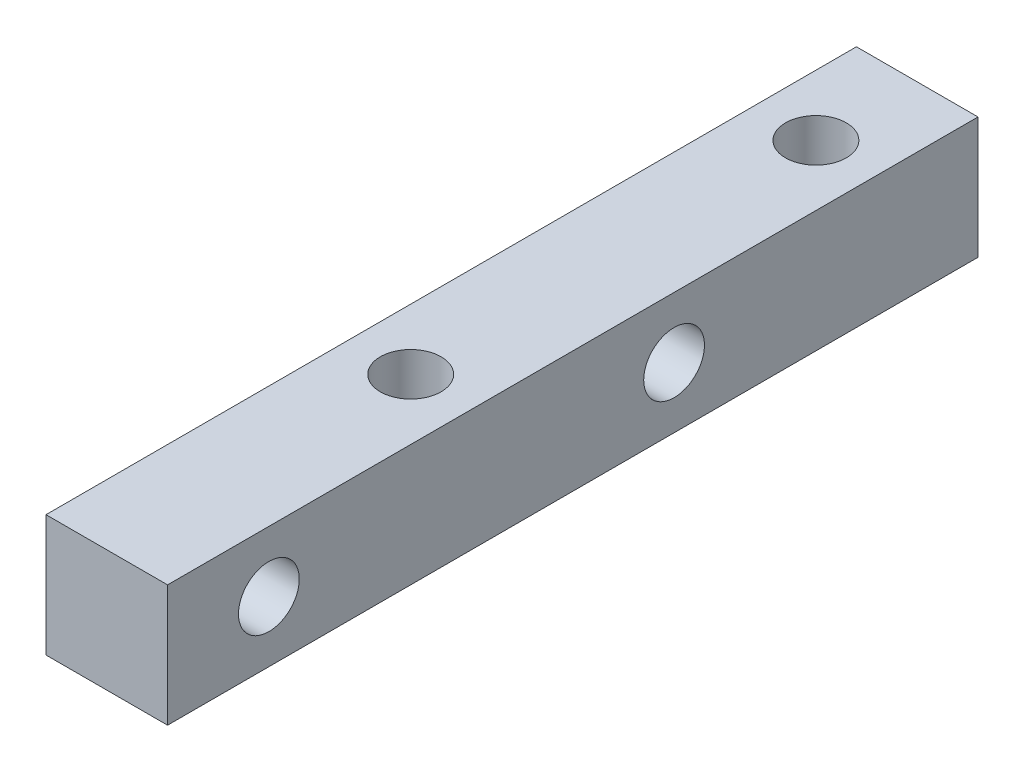
ISO-10303-21;
HEADER;
FILE_DESCRIPTION(('STEP AP214'),'2;1');
FILE_NAME('part.step','',(''),(''),'','','');
FILE_SCHEMA(('AUTOMOTIVE_DESIGN { 1 0 10303 214 1 1 1 1 }'));
ENDSEC;
DATA;
#1=APPLICATION_CONTEXT('core data for automotive mechanical design processes');
#2=APPLICATION_PROTOCOL_DEFINITION('international standard','automotive_design',2000,#1);
#3=PRODUCT_CONTEXT('',#1,'mechanical');
#4=PRODUCT('Part','Part','',(#3));
#5=PRODUCT_RELATED_PRODUCT_CATEGORY('part','',(#4));
#6=PRODUCT_DEFINITION_FORMATION('','',#4);
#7=PRODUCT_DEFINITION_CONTEXT('part definition',#1,'design');
#8=PRODUCT_DEFINITION('design','',#6,#7);
#9=PRODUCT_DEFINITION_SHAPE('','',#8);
#10=(LENGTH_UNIT() NAMED_UNIT(*) SI_UNIT(.MILLI.,.METRE.));
#11=(NAMED_UNIT(*) PLANE_ANGLE_UNIT() SI_UNIT($,.RADIAN.));
#12=(NAMED_UNIT(*) SI_UNIT($,.STERADIAN.) SOLID_ANGLE_UNIT());
#13=UNCERTAINTY_MEASURE_WITH_UNIT(LENGTH_MEASURE(1.E-05),#10,'distance_accuracy_value','');
#14=(GEOMETRIC_REPRESENTATION_CONTEXT(3) GLOBAL_UNCERTAINTY_ASSIGNED_CONTEXT((#13)) GLOBAL_UNIT_ASSIGNED_CONTEXT((#10,
#11,#12)) REPRESENTATION_CONTEXT('',''));
#15=CARTESIAN_POINT('',(0.,0.,0.));
#16=DIRECTION('',(0.,0.,1.));
#17=DIRECTION('',(1.,0.,0.));
#18=AXIS2_PLACEMENT_3D('',#15,#16,#17);
#19=CARTESIAN_POINT('',(0.,0.,40.));
#20=DIRECTION('',(1.,0.,0.));
#21=DIRECTION('',(0.,0.,-1.));
#22=AXIS2_PLACEMENT_3D('',#19,#20,#21);
#23=PLANE('',#22);
#24=CARTESIAN_POINT('',(0.,3.,35.));
#25=DIRECTION('',(-1.,0.,0.));
#26=DIRECTION('',(0.,0.,1.));
#27=AXIS2_PLACEMENT_3D('',#24,#25,#26);
#28=CIRCLE('',#27,1.5);
#29=CARTESIAN_POINT('',(0.,3.,36.5));
#30=VERTEX_POINT('',#29);
#31=EDGE_CURVE('E124',#30,#30,#28,.T.);
#32=ORIENTED_EDGE('',*,*,#31,.F.);
#33=EDGE_LOOP('',(#32));
#34=FACE_BOUND('',#33,.T.);
#35=CARTESIAN_POINT('',(0.,3.,15.));
#36=DIRECTION('',(-1.,0.,0.));
#37=DIRECTION('',(0.,0.,1.));
#38=AXIS2_PLACEMENT_3D('',#35,#36,#37);
#39=CIRCLE('',#38,1.5);
#40=CARTESIAN_POINT('',(0.,3.,16.5));
#41=VERTEX_POINT('',#40);
#42=EDGE_CURVE('E130',#41,#41,#39,.T.);
#43=ORIENTED_EDGE('',*,*,#42,.F.);
#44=EDGE_LOOP('',(#43));
#45=FACE_BOUND('',#44,.T.);
#46=DIRECTION('',(0.,-1.,0.));
#47=VECTOR('',#46,1.);
#48=CARTESIAN_POINT('',(0.,0.,0.));
#49=LINE('',#48,#47);
#50=CARTESIAN_POINT('',(0.,6.,0.));
#51=VERTEX_POINT('',#50);
#52=CARTESIAN_POINT('',(0.,0.,0.));
#53=VERTEX_POINT('',#52);
#54=EDGE_CURVE('E114',#51,#53,#49,.T.);
#55=ORIENTED_EDGE('',*,*,#54,.T.);
#56=DIRECTION('',(0.,0.,-1.));
#57=VECTOR('',#56,1.);
#58=CARTESIAN_POINT('',(0.,0.,40.));
#59=LINE('',#58,#57);
#60=CARTESIAN_POINT('',(0.,0.,40.));
#61=VERTEX_POINT('',#60);
#62=EDGE_CURVE('E11',#61,#53,#59,.T.);
#63=ORIENTED_EDGE('',*,*,#62,.F.);
#64=DIRECTION('',(0.,-1.,0.));
#65=VECTOR('',#64,1.);
#66=CARTESIAN_POINT('',(0.,0.,40.));
#67=LINE('',#66,#65);
#68=CARTESIAN_POINT('',(0.,6.,40.));
#69=VERTEX_POINT('',#68);
#70=EDGE_CURVE('E101',#69,#61,#67,.T.);
#71=ORIENTED_EDGE('',*,*,#70,.F.);
#72=DIRECTION('',(0.,0.,-1.));
#73=VECTOR('',#72,1.);
#74=CARTESIAN_POINT('',(0.,6.,40.));
#75=LINE('',#74,#73);
#76=EDGE_CURVE('E110',#69,#51,#75,.T.);
#77=ORIENTED_EDGE('',*,*,#76,.T.);
#78=EDGE_LOOP('',(#55,#63,#71,#77));
#79=FACE_BOUND('',#78,.T.);
#80=ADVANCED_FACE('F48',(#34,#45,#79),#23,.F.);
#81=CARTESIAN_POINT('',(0.,0.,40.));
#82=DIRECTION('',(0.,1.,0.));
#83=DIRECTION('',(0.,0.,1.));
#84=AXIS2_PLACEMENT_3D('',#81,#82,#83);
#85=PLANE('',#84);
#86=CARTESIAN_POINT('',(3.,0.,5.));
#87=DIRECTION('',(0.,1.,0.));
#88=DIRECTION('',(0.,0.,1.));
#89=AXIS2_PLACEMENT_3D('',#86,#87,#88);
#90=CIRCLE('',#89,1.5);
#91=CARTESIAN_POINT('',(3.,0.,6.5));
#92=VERTEX_POINT('',#91);
#93=EDGE_CURVE('E117',#92,#92,#90,.T.);
#94=ORIENTED_EDGE('',*,*,#93,.T.);
#95=EDGE_LOOP('',(#94));
#96=FACE_BOUND('',#95,.T.);
#97=CARTESIAN_POINT('',(3.,0.,25.));
#98=DIRECTION('',(0.,1.,0.));
#99=DIRECTION('',(0.,0.,1.));
#100=AXIS2_PLACEMENT_3D('',#97,#98,#99);
#101=CIRCLE('',#100,1.5);
#102=CARTESIAN_POINT('',(3.,0.,26.5));
#103=VERTEX_POINT('',#102);
#104=EDGE_CURVE('E140',#103,#103,#101,.T.);
#105=ORIENTED_EDGE('',*,*,#104,.T.);
#106=EDGE_LOOP('',(#105));
#107=FACE_BOUND('',#106,.T.);
#108=DIRECTION('',(1.,0.,0.));
#109=VECTOR('',#108,1.);
#110=CARTESIAN_POINT('',(0.,0.,0.));
#111=LINE('',#110,#109);
#112=CARTESIAN_POINT('',(6.,0.,0.));
#113=VERTEX_POINT('',#112);
#114=EDGE_CURVE('E105',#53,#113,#111,.T.);
#115=ORIENTED_EDGE('',*,*,#114,.T.);
#116=DIRECTION('',(0.,0.,-1.));
#117=VECTOR('',#116,1.);
#118=CARTESIAN_POINT('',(6.,0.,40.));
#119=LINE('',#118,#117);
#120=CARTESIAN_POINT('',(6.,0.,40.));
#121=VERTEX_POINT('',#120);
#122=EDGE_CURVE('E57',#121,#113,#119,.T.);
#123=ORIENTED_EDGE('',*,*,#122,.F.);
#124=DIRECTION('',(1.,0.,0.));
#125=VECTOR('',#124,1.);
#126=CARTESIAN_POINT('',(0.,0.,40.));
#127=LINE('',#126,#125);
#128=EDGE_CURVE('E96',#61,#121,#127,.T.);
#129=ORIENTED_EDGE('',*,*,#128,.F.);
#130=ORIENTED_EDGE('',*,*,#62,.T.);
#131=EDGE_LOOP('',(#115,#123,#129,#130));
#132=FACE_BOUND('',#131,.T.);
#133=ADVANCED_FACE('F104',(#96,#107,#132),#85,.F.);
#134=CARTESIAN_POINT('',(6.,0.,40.));
#135=DIRECTION('',(-1.,0.,0.));
#136=DIRECTION('',(0.,0.,1.));
#137=AXIS2_PLACEMENT_3D('',#134,#135,#136);
#138=PLANE('',#137);
#139=CARTESIAN_POINT('',(6.,3.,35.));
#140=DIRECTION('',(-1.,0.,0.));
#141=DIRECTION('',(0.,0.,1.));
#142=AXIS2_PLACEMENT_3D('',#139,#140,#141);
#143=CIRCLE('',#142,1.5);
#144=CARTESIAN_POINT('',(6.,3.,36.5));
#145=VERTEX_POINT('',#144);
#146=EDGE_CURVE('E51',#145,#145,#143,.T.);
#147=ORIENTED_EDGE('',*,*,#146,.T.);
#148=EDGE_LOOP('',(#147));
#149=FACE_BOUND('',#148,.T.);
#150=CARTESIAN_POINT('',(6.,3.,15.));
#151=DIRECTION('',(-1.,0.,0.));
#152=DIRECTION('',(0.,0.,1.));
#153=AXIS2_PLACEMENT_3D('',#150,#151,#152);
#154=CIRCLE('',#153,1.5);
#155=CARTESIAN_POINT('',(6.,3.,16.5));
#156=VERTEX_POINT('',#155);
#157=EDGE_CURVE('E122',#156,#156,#154,.T.);
#158=ORIENTED_EDGE('',*,*,#157,.T.);
#159=EDGE_LOOP('',(#158));
#160=FACE_BOUND('',#159,.T.);
#161=DIRECTION('',(0.,1.,0.));
#162=VECTOR('',#161,1.);
#163=CARTESIAN_POINT('',(6.,0.,0.));
#164=LINE('',#163,#162);
#165=CARTESIAN_POINT('',(6.,6.,0.));
#166=VERTEX_POINT('',#165);
#167=EDGE_CURVE('E83',#113,#166,#164,.T.);
#168=ORIENTED_EDGE('',*,*,#167,.T.);
#169=DIRECTION('',(0.,0.,-1.));
#170=VECTOR('',#169,1.);
#171=CARTESIAN_POINT('',(6.,6.,40.));
#172=LINE('',#171,#170);
#173=CARTESIAN_POINT('',(6.,6.,40.));
#174=VERTEX_POINT('',#173);
#175=EDGE_CURVE('E106',#174,#166,#172,.T.);
#176=ORIENTED_EDGE('',*,*,#175,.F.);
#177=DIRECTION('',(0.,1.,0.));
#178=VECTOR('',#177,1.);
#179=CARTESIAN_POINT('',(6.,0.,40.));
#180=LINE('',#179,#178);
#181=EDGE_CURVE('E99',#121,#174,#180,.T.);
#182=ORIENTED_EDGE('',*,*,#181,.F.);
#183=ORIENTED_EDGE('',*,*,#122,.T.);
#184=EDGE_LOOP('',(#168,#176,#182,#183));
#185=FACE_BOUND('',#184,.T.);
#186=ADVANCED_FACE('F108',(#149,#160,#185),#138,.F.);
#187=CARTESIAN_POINT('',(0.,6.,40.));
#188=DIRECTION('',(0.,-1.,0.));
#189=DIRECTION('',(0.,0.,-1.));
#190=AXIS2_PLACEMENT_3D('',#187,#188,#189);
#191=PLANE('',#190);
#192=CARTESIAN_POINT('',(3.,6.,5.));
#193=DIRECTION('',(0.,1.,0.));
#194=DIRECTION('',(0.,0.,1.));
#195=AXIS2_PLACEMENT_3D('',#192,#193,#194);
#196=CIRCLE('',#195,1.5);
#197=CARTESIAN_POINT('',(3.,6.,6.5));
#198=VERTEX_POINT('',#197);
#199=EDGE_CURVE('E137',#198,#198,#196,.T.);
#200=ORIENTED_EDGE('',*,*,#199,.F.);
#201=EDGE_LOOP('',(#200));
#202=FACE_BOUND('',#201,.T.);
#203=CARTESIAN_POINT('',(3.,6.,25.));
#204=DIRECTION('',(0.,1.,0.));
#205=DIRECTION('',(0.,0.,1.));
#206=AXIS2_PLACEMENT_3D('',#203,#204,#205);
#207=CIRCLE('',#206,1.5);
#208=CARTESIAN_POINT('',(3.,6.,26.5));
#209=VERTEX_POINT('',#208);
#210=EDGE_CURVE('E128',#209,#209,#207,.T.);
#211=ORIENTED_EDGE('',*,*,#210,.F.);
#212=EDGE_LOOP('',(#211));
#213=FACE_BOUND('',#212,.T.);
#214=DIRECTION('',(-1.,0.,0.));
#215=VECTOR('',#214,1.);
#216=CARTESIAN_POINT('',(0.,6.,0.));
#217=LINE('',#216,#215);
#218=EDGE_CURVE('E89',#166,#51,#217,.T.);
#219=ORIENTED_EDGE('',*,*,#218,.T.);
#220=ORIENTED_EDGE('',*,*,#76,.F.);
#221=DIRECTION('',(-1.,0.,0.));
#222=VECTOR('',#221,1.);
#223=CARTESIAN_POINT('',(0.,6.,40.));
#224=LINE('',#223,#222);
#225=EDGE_CURVE('E66',#174,#69,#224,.T.);
#226=ORIENTED_EDGE('',*,*,#225,.F.);
#227=ORIENTED_EDGE('',*,*,#175,.T.);
#228=EDGE_LOOP('',(#219,#220,#226,#227));
#229=FACE_BOUND('',#228,.T.);
#230=ADVANCED_FACE('F181',(#202,#213,#229),#191,.F.);
#231=CARTESIAN_POINT('',(0.,0.,40.));
#232=DIRECTION('',(0.,0.,-1.));
#233=DIRECTION('',(-1.,0.,0.));
#234=AXIS2_PLACEMENT_3D('',#231,#232,#233);
#235=PLANE('',#234);
#236=ORIENTED_EDGE('',*,*,#70,.T.);
#237=ORIENTED_EDGE('',*,*,#128,.T.);
#238=ORIENTED_EDGE('',*,*,#181,.T.);
#239=ORIENTED_EDGE('',*,*,#225,.T.);
#240=EDGE_LOOP('',(#236,#237,#238,#239));
#241=FACE_BOUND('',#240,.T.);
#242=ADVANCED_FACE('F97',(#241),#235,.F.);
#243=CARTESIAN_POINT('',(0.,0.,0.));
#244=DIRECTION('',(0.,0.,-1.));
#245=DIRECTION('',(-1.,0.,0.));
#246=AXIS2_PLACEMENT_3D('',#243,#244,#245);
#247=PLANE('',#246);
#248=ORIENTED_EDGE('',*,*,#54,.F.);
#249=ORIENTED_EDGE('',*,*,#218,.F.);
#250=ORIENTED_EDGE('',*,*,#167,.F.);
#251=ORIENTED_EDGE('',*,*,#114,.F.);
#252=EDGE_LOOP('',(#248,#249,#250,#251));
#253=FACE_BOUND('',#252,.T.);
#254=ADVANCED_FACE('F163',(#253),#247,.T.);
#255=CARTESIAN_POINT('',(3.,-44.,25.));
#256=DIRECTION('',(0.,1.,0.));
#257=DIRECTION('',(0.,0.,1.));
#258=AXIS2_PLACEMENT_3D('',#255,#256,#257);
#259=CYLINDRICAL_SURFACE('',#258,1.5);
#260=ORIENTED_EDGE('',*,*,#210,.T.);
#261=EDGE_LOOP('',(#260));
#262=FACE_BOUND('',#261,.T.);
#263=ORIENTED_EDGE('',*,*,#104,.F.);
#264=EDGE_LOOP('',(#263));
#265=FACE_BOUND('',#264,.T.);
#266=ADVANCED_FACE('F153',(#262,#265),#259,.F.);
#267=CARTESIAN_POINT('',(3.,-44.,5.));
#268=DIRECTION('',(0.,1.,0.));
#269=DIRECTION('',(0.,0.,1.));
#270=AXIS2_PLACEMENT_3D('',#267,#268,#269);
#271=CYLINDRICAL_SURFACE('',#270,1.5);
#272=ORIENTED_EDGE('',*,*,#199,.T.);
#273=EDGE_LOOP('',(#272));
#274=FACE_BOUND('',#273,.T.);
#275=ORIENTED_EDGE('',*,*,#93,.F.);
#276=EDGE_LOOP('',(#275));
#277=FACE_BOUND('',#276,.T.);
#278=ADVANCED_FACE('F150',(#274,#277),#271,.F.);
#279=CARTESIAN_POINT('',(50.,3.,15.));
#280=DIRECTION('',(-1.,0.,0.));
#281=DIRECTION('',(0.,0.,1.));
#282=AXIS2_PLACEMENT_3D('',#279,#280,#281);
#283=CYLINDRICAL_SURFACE('',#282,1.5);
#284=ORIENTED_EDGE('',*,*,#42,.T.);
#285=EDGE_LOOP('',(#284));
#286=FACE_BOUND('',#285,.T.);
#287=ORIENTED_EDGE('',*,*,#157,.F.);
#288=EDGE_LOOP('',(#287));
#289=FACE_BOUND('',#288,.T.);
#290=ADVANCED_FACE('F152',(#286,#289),#283,.F.);
#291=CARTESIAN_POINT('',(50.,3.,35.));
#292=DIRECTION('',(-1.,0.,0.));
#293=DIRECTION('',(0.,0.,1.));
#294=AXIS2_PLACEMENT_3D('',#291,#292,#293);
#295=CYLINDRICAL_SURFACE('',#294,1.5);
#296=ORIENTED_EDGE('',*,*,#31,.T.);
#297=EDGE_LOOP('',(#296));
#298=FACE_BOUND('',#297,.T.);
#299=ORIENTED_EDGE('',*,*,#146,.F.);
#300=EDGE_LOOP('',(#299));
#301=FACE_BOUND('',#300,.T.);
#302=ADVANCED_FACE('F160',(#298,#301),#295,.F.);
#303=CLOSED_SHELL('',(#80,#133,#186,#230,#242,#254,#266,#278,#290,#302));
#304=MANIFOLD_SOLID_BREP('B2',#303);
#305=ADVANCED_BREP_SHAPE_REPRESENTATION('',(#18,#304),#14);
#306=SHAPE_DEFINITION_REPRESENTATION(#9,#305);
ENDSEC;
END-ISO-10303-21;
